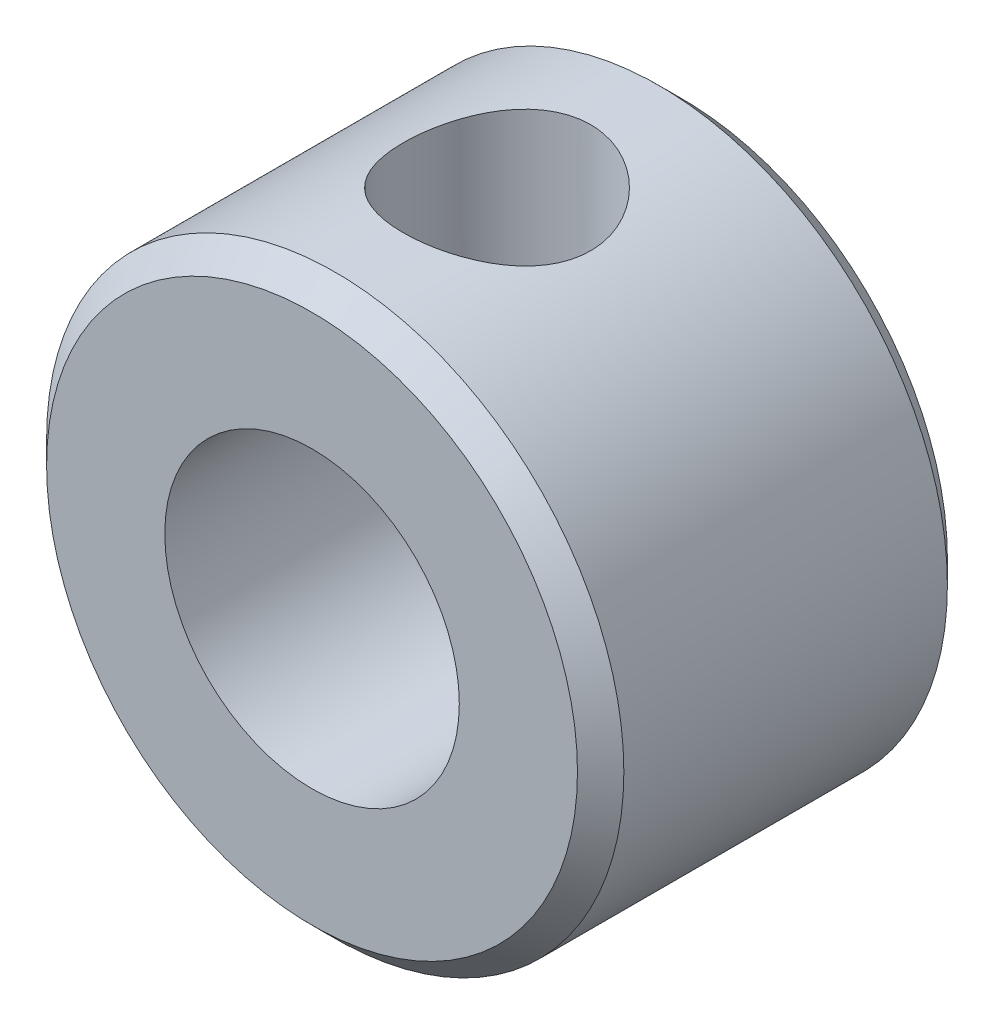
ISO-10303-21;
HEADER;
FILE_DESCRIPTION(('STEP AP214'),'2;1');
FILE_NAME('part.step','',(''),(''),'','','');
FILE_SCHEMA(('AUTOMOTIVE_DESIGN { 1 0 10303 214 1 1 1 1 }'));
ENDSEC;
DATA;
#1=APPLICATION_CONTEXT('core data for automotive mechanical design processes');
#2=APPLICATION_PROTOCOL_DEFINITION('international standard','automotive_design',2000,#1);
#3=PRODUCT_CONTEXT('',#1,'mechanical');
#4=PRODUCT('Part','Part','',(#3));
#5=PRODUCT_RELATED_PRODUCT_CATEGORY('part','',(#4));
#6=PRODUCT_DEFINITION_FORMATION('','',#4);
#7=PRODUCT_DEFINITION_CONTEXT('part definition',#1,'design');
#8=PRODUCT_DEFINITION('design','',#6,#7);
#9=PRODUCT_DEFINITION_SHAPE('','',#8);
#10=(LENGTH_UNIT() NAMED_UNIT(*) SI_UNIT(.MILLI.,.METRE.));
#11=(NAMED_UNIT(*) PLANE_ANGLE_UNIT() SI_UNIT($,.RADIAN.));
#12=(NAMED_UNIT(*) SI_UNIT($,.STERADIAN.) SOLID_ANGLE_UNIT());
#13=UNCERTAINTY_MEASURE_WITH_UNIT(LENGTH_MEASURE(1.E-05),#10,'distance_accuracy_value','');
#14=(GEOMETRIC_REPRESENTATION_CONTEXT(3) GLOBAL_UNCERTAINTY_ASSIGNED_CONTEXT((#13)) GLOBAL_UNIT_ASSIGNED_CONTEXT((#10,
#11,#12)) REPRESENTATION_CONTEXT('',''));
#15=CARTESIAN_POINT('',(0.,0.,0.));
#16=DIRECTION('',(0.,0.,1.));
#17=DIRECTION('',(1.,0.,0.));
#18=AXIS2_PLACEMENT_3D('',#15,#16,#17);
#19=CARTESIAN_POINT('',(0.,0.,-3.9878));
#20=DIRECTION('',(0.,0.,1.));
#21=DIRECTION('',(1.,0.,0.));
#22=AXIS2_PLACEMENT_3D('',#19,#20,#21);
#23=CYLINDRICAL_SURFACE('',#22,6.223);
#24=CARTESIAN_POINT('',(0.,6.223,-2.01929999999999));
#25=CARTESIAN_POINT('',(-0.110343510764421,6.22299991240961,-2.01929995614678));
#26=CARTESIAN_POINT('',(-0.220688547621907,6.2200378148079,-2.01022591707558));
#27=CARTESIAN_POINT('',(-0.43813838669422,6.20851250591087,-1.97427367910987));
#28=CARTESIAN_POINT('',(-0.545242680198986,6.19994841997657,-1.94739270000778));
#29=CARTESIAN_POINT('',(-0.753044440253262,6.17815186021323,-1.87683801107906));
#30=CARTESIAN_POINT('',(-0.853751971434932,6.16492694581129,-1.83319148315432));
#31=CARTESIAN_POINT('',(-1.04641817113306,6.1351653072985,-1.73046441937539));
#32=CARTESIAN_POINT('',(-1.1383752550724,6.11862798503645,-1.67138109537305));
#33=CARTESIAN_POINT('',(-1.31396737189153,6.08337754667322,-1.53740622773788));
#34=CARTESIAN_POINT('',(-1.3972732105779,6.06461431779935,-1.46209648115979));
#35=CARTESIAN_POINT('',(-1.55032134253976,6.02730870361427,-1.29869621513091));
#36=CARTESIAN_POINT('',(-1.62006085401559,6.00876636432706,-1.21060308087573));
#37=CARTESIAN_POINT('',(-1.74583492561646,5.97345652151974,-1.02122227979621));
#38=CARTESIAN_POINT('',(-1.80144878020222,5.95675042919629,-0.919642661754934));
#39=CARTESIAN_POINT('',(-1.89466489357519,5.92776301144131,-0.707942566763864));
#40=CARTESIAN_POINT('',(-1.93227232164475,5.91548041636405,-0.597824551576659));
#41=CARTESIAN_POINT('',(-1.98718617606239,5.8972568373458,-0.375904928722071));
#42=CARTESIAN_POINT('',(-2.00510682766404,5.89112453580322,-0.264271474885946));
#43=CARTESIAN_POINT('',(-2.02205809222139,5.88532903493098,-0.0394268501054633));
#44=CARTESIAN_POINT('',(-2.02109418444673,5.88566395916454,0.0737838536806623));
#45=CARTESIAN_POINT('',(-2.00078210158323,5.89259688238839,0.293399887668685));
#46=CARTESIAN_POINT('',(-1.98222639906683,5.89892489305517,0.399888495860971));
#47=CARTESIAN_POINT('',(-1.92854683026954,5.91669057019375,0.608150545824619));
#48=CARTESIAN_POINT('',(-1.89342107710975,5.92812881857502,0.709923449155371));
#49=CARTESIAN_POINT('',(-1.80706226080697,5.95502476907974,0.907703168927859));
#50=CARTESIAN_POINT('',(-1.75558837224277,5.97054192734821,1.00359639695847));
#51=CARTESIAN_POINT('',(-1.63816163387295,6.00382139153284,1.18563882560891));
#52=CARTESIAN_POINT('',(-1.57220478037491,6.02158431769528,1.27178532182985));
#53=CARTESIAN_POINT('',(-1.42384264461782,6.05842512580876,1.43635387075155));
#54=CARTESIAN_POINT('',(-1.34078671208325,6.0775246602616,1.51418564830078));
#55=CARTESIAN_POINT('',(-1.16256504036133,6.11411780505291,1.65496565190694));
#56=CARTESIAN_POINT('',(-1.06739825933907,6.13161127700682,1.71791259616402));
#57=CARTESIAN_POINT('',(-0.866453897033233,6.16323042196182,1.82757844745628));
#58=CARTESIAN_POINT('',(-0.760588790472581,6.17732447677571,1.87414671720461));
#59=CARTESIAN_POINT('',(-0.541961980897404,6.20032786546434,1.94863387483665));
#60=CARTESIAN_POINT('',(-0.429202556201084,6.20923890201098,1.97655888765763));
#61=CARTESIAN_POINT('',(-0.204990772345169,6.22059363722692,2.01193851203171));
#62=CARTESIAN_POINT('',(-0.0936769597661024,6.22328937755838,2.02019136366894));
#63=CARTESIAN_POINT('',(0.128762437777148,6.2226611691532,2.01825623046863));
#64=CARTESIAN_POINT('',(0.239888049838433,6.21933817681091,2.00807117546895));
#65=CARTESIAN_POINT('',(0.455651824107412,6.20721196220202,1.97018510032538));
#66=CARTESIAN_POINT('',(0.560384217898753,6.19856010961232,1.94296756755853));
#67=CARTESIAN_POINT('',(0.763759608535509,6.17680086010011,1.87238734228447));
#68=CARTESIAN_POINT('',(0.862401836020595,6.16369290160065,1.8290226147751));
#69=CARTESIAN_POINT('',(1.05359936174091,6.13394352805831,1.72614783664219));
#70=CARTESIAN_POINT('',(1.14593516013282,6.11722049698501,1.66625410145686));
#71=CARTESIAN_POINT('',(1.31950881642813,6.08214432282242,1.53247626579736));
#72=CARTESIAN_POINT('',(1.40074343347139,6.06379070627223,1.45858809476827));
#73=CARTESIAN_POINT('',(1.55343383808315,6.02652625590369,1.29516360033093));
#74=CARTESIAN_POINT('',(1.6243201750735,6.00762532200677,1.20509171470334));
#75=CARTESIAN_POINT('',(1.75003390231434,5.97221818954891,1.01392259810123));
#76=CARTESIAN_POINT('',(1.80486134234447,5.95571198356483,0.912825401304514));
#77=CARTESIAN_POINT('',(1.89660526724315,5.92713535507377,0.702549181360383));
#78=CARTESIAN_POINT('',(1.93357362017008,5.9150521120479,0.593394636667703));
#79=CARTESIAN_POINT('',(1.98845303510977,5.89683270373288,0.369931313012606));
#80=CARTESIAN_POINT('',(2.00637209551557,5.89069404253669,0.25562471831838));
#81=CARTESIAN_POINT('',(2.02204123413352,5.88533256371676,0.0310931150116252));
#82=CARTESIAN_POINT('',(2.02073164410965,5.88578729748728,-0.07905933694812));
#83=CARTESIAN_POINT('',(2.00027582938624,5.89277012260364,-0.297489276437896));
#84=CARTESIAN_POINT('',(1.9811305633057,5.89929788754056,-0.405766864418174));
#85=CARTESIAN_POINT('',(1.92619730522043,5.91745740473879,-0.615547059914038));
#86=CARTESIAN_POINT('',(1.89069848375472,5.92900028365708,-0.717133676910205));
#87=CARTESIAN_POINT('',(1.80429700414978,5.95586085763748,-0.912988498558728));
#88=CARTESIAN_POINT('',(1.75339104448042,5.97117936163152,-1.00725512919665));
#89=CARTESIAN_POINT('',(1.63513965685479,6.0046621994555,-1.19005445884109));
#90=CARTESIAN_POINT('',(1.56719698040182,6.02291859838509,-1.27818386312159));
#91=CARTESIAN_POINT('',(1.41782817394549,6.05981870833697,-1.44209457678211));
#92=CARTESIAN_POINT('',(1.33639832250818,6.07846252501192,-1.51787246660212));
#93=CARTESIAN_POINT('',(1.15882450880469,6.11484664134321,-1.6576855599286));
#94=CARTESIAN_POINT('',(1.06225466606378,6.1325298177681,-1.72119649576464));
#95=CARTESIAN_POINT('',(0.859239293084725,6.16424931267437,-1.83100717676466));
#96=CARTESIAN_POINT('',(0.752796898059275,6.17828678357249,-1.87731236270799));
#97=CARTESIAN_POINT('',(0.539855257107079,6.20040511556031,-1.94883343922131));
#98=CARTESIAN_POINT('',(0.433767560008049,6.20880096333192,-1.97517754724874));
#99=CARTESIAN_POINT('',(0.21845322892127,6.22009778308289,-2.01040873404282));
#100=CARTESIAN_POINT('',(0.109227362148477,6.22300008670439,-2.01930004340961));
#101=CARTESIAN_POINT('',(0.,6.223,-2.01929999999999));
#102=B_SPLINE_CURVE_WITH_KNOTS('',3,(#24,#25,#26,#27,#28,#29,#30,#31,#32,#33,#34,#35,#36,#37,
#38,#39,#40,#41,#42,#43,#44,#45,#46,#47,#48,#49,#50,#51,#52,#53,#54,#55,#56,#57,#58,#59,#60,#61,
#62,#63,#64,#65,#66,#67,#68,#69,#70,#71,#72,#73,#74,#75,#76,#77,#78,#79,#80,#81,#82,#83,#84,#85,
#86,#87,#88,#89,#90,#91,#92,#93,#94,#95,#96,#97,#98,#99,#100,#101),.UNSPECIFIED.,.T.,.F.,(4,2,2,
2,2,2,2,2,2,2,2,2,2,2,2,2,2,2,2,2,2,2,2,2,2,2,2,2,2,2,2,2,2,2,2,2,2,2,4),(0.,0.330628782954436,
0.661309199337908,0.991455732778822,1.32166193757536,1.66169717247375,2.00180205887857,
2.35108650175531,2.70027061189306,3.03822025280494,3.3760718406067,3.69939275834749,
4.02275050245372,4.35111170304979,4.67956379083992,5.0242102248934,5.3688863271998,
5.71665431364785,6.06430799031173,6.397595073083,6.73082920020058,7.05500825131018,
7.37922817196306,7.71171981318648,8.0443083150346,8.39117347655747,8.73803756285024,
9.08388810501269,9.4295933744587,9.75845152363048,10.0872919985922,10.4105286622561,
10.7338346400298,11.0706289080726,11.4075162609917,11.7565965905323,12.1055664402242,
12.4329302046765,12.760214605565),.UNSPECIFIED.);
#103=CARTESIAN_POINT('',(0.,6.223,-2.01929999999999));
#104=VERTEX_POINT('',#103);
#105=EDGE_CURVE('E70',#104,#104,#102,.T.);
#106=ORIENTED_EDGE('',*,*,#105,.F.);
#107=EDGE_LOOP('',(#106));
#108=FACE_BOUND('',#107,.T.);
#109=CARTESIAN_POINT('',(0.,0.,-3.4878));
#110=DIRECTION('',(0.,0.,1.));
#111=DIRECTION('',(1.,0.,0.));
#112=AXIS2_PLACEMENT_3D('',#109,#110,#111);
#113=CIRCLE('',#112,6.223);
#114=CARTESIAN_POINT('',(6.223,0.,-3.4878));
#115=VERTEX_POINT('',#114);
#116=EDGE_CURVE('E47',#115,#115,#113,.T.);
#117=ORIENTED_EDGE('',*,*,#116,.T.);
#118=EDGE_LOOP('',(#117));
#119=FACE_BOUND('',#118,.T.);
#120=CARTESIAN_POINT('',(0.,0.,3.4878));
#121=DIRECTION('',(0.,0.,1.));
#122=DIRECTION('',(1.,0.,0.));
#123=AXIS2_PLACEMENT_3D('',#120,#121,#122);
#124=CIRCLE('',#123,6.223);
#125=CARTESIAN_POINT('',(6.223,0.,3.4878));
#126=VERTEX_POINT('',#125);
#127=EDGE_CURVE('E51',#126,#126,#124,.F.);
#128=ORIENTED_EDGE('',*,*,#127,.T.);
#129=EDGE_LOOP('',(#128));
#130=FACE_BOUND('',#129,.T.);
#131=ADVANCED_FACE('F35',(#108,#119,#130),#23,.T.);
#132=CARTESIAN_POINT('',(0.,0.,-3.9878));
#133=DIRECTION('',(0.,0.,1.));
#134=DIRECTION('',(1.,0.,0.));
#135=AXIS2_PLACEMENT_3D('',#132,#133,#134);
#136=PLANE('',#135);
#137=CARTESIAN_POINT('',(0.,0.,-3.9878));
#138=DIRECTION('',(0.,0.,1.));
#139=DIRECTION('',(1.,0.,0.));
#140=AXIS2_PLACEMENT_3D('',#137,#138,#139);
#141=CIRCLE('',#140,5.723);
#142=CARTESIAN_POINT('',(5.723,0.,-3.9878));
#143=VERTEX_POINT('',#142);
#144=EDGE_CURVE('E43',#143,#143,#141,.F.);
#145=ORIENTED_EDGE('',*,*,#144,.T.);
#146=EDGE_LOOP('',(#145));
#147=FACE_BOUND('',#146,.T.);
#148=CARTESIAN_POINT('',(0.,0.,-3.9878));
#149=DIRECTION('',(0.,0.,1.));
#150=DIRECTION('',(1.,0.,0.));
#151=AXIS2_PLACEMENT_3D('',#148,#149,#150);
#152=CIRCLE('',#151,3.175);
#153=CARTESIAN_POINT('',(3.175,0.,-3.9878));
#154=VERTEX_POINT('',#153);
#155=EDGE_CURVE('E59',#154,#154,#152,.F.);
#156=ORIENTED_EDGE('',*,*,#155,.F.);
#157=EDGE_LOOP('',(#156));
#158=FACE_BOUND('',#157,.T.);
#159=ADVANCED_FACE('F98',(#147,#158),#136,.F.);
#160=CARTESIAN_POINT('',(0.,0.,3.9878));
#161=DIRECTION('',(0.,0.,1.));
#162=DIRECTION('',(1.,0.,0.));
#163=AXIS2_PLACEMENT_3D('',#160,#161,#162);
#164=PLANE('',#163);
#165=CARTESIAN_POINT('',(0.,0.,3.9878));
#166=DIRECTION('',(0.,0.,1.));
#167=DIRECTION('',(1.,0.,0.));
#168=AXIS2_PLACEMENT_3D('',#165,#166,#167);
#169=CIRCLE('',#168,5.723);
#170=CARTESIAN_POINT('',(5.723,0.,3.9878));
#171=VERTEX_POINT('',#170);
#172=EDGE_CURVE('E10',#171,#171,#169,.T.);
#173=ORIENTED_EDGE('',*,*,#172,.T.);
#174=EDGE_LOOP('',(#173));
#175=FACE_BOUND('',#174,.T.);
#176=CARTESIAN_POINT('',(0.,0.,3.9878));
#177=DIRECTION('',(0.,0.,1.));
#178=DIRECTION('',(1.,0.,0.));
#179=AXIS2_PLACEMENT_3D('',#176,#177,#178);
#180=CIRCLE('',#179,3.175);
#181=CARTESIAN_POINT('',(3.175,0.,3.9878));
#182=VERTEX_POINT('',#181);
#183=EDGE_CURVE('E56',#182,#182,#180,.F.);
#184=ORIENTED_EDGE('',*,*,#183,.T.);
#185=EDGE_LOOP('',(#184));
#186=FACE_BOUND('',#185,.T.);
#187=ADVANCED_FACE('F91',(#175,#186),#164,.T.);
#188=CARTESIAN_POINT('',(0.,0.,-3.9878));
#189=DIRECTION('',(0.,0.,1.));
#190=DIRECTION('',(1.,0.,0.));
#191=AXIS2_PLACEMENT_3D('',#188,#189,#190);
#192=CYLINDRICAL_SURFACE('',#191,3.175);
#193=CARTESIAN_POINT('',(0.,3.175,-2.01929999999999));
#194=CARTESIAN_POINT('',(0.102275041570351,3.17499212218742,-2.01929143965553));
#195=CARTESIAN_POINT('',(0.204663948744718,3.17000679874075,-2.01147696356882));
#196=CARTESIAN_POINT('',(0.406278072049932,3.15053510862914,-1.98064527104774));
#197=CARTESIAN_POINT('',(0.505497460962832,3.13603219182987,-1.95760157203821));
#198=CARTESIAN_POINT('',(0.697469668100845,3.09897945913749,-1.89767536654758));
#199=CARTESIAN_POINT('',(0.790251965874981,3.07646968317457,-1.86086167332952));
#200=CARTESIAN_POINT('',(0.96798385605442,3.02526013654449,-1.77491840151874));
#201=CARTESIAN_POINT('',(1.05293403637499,2.9965608310332,-1.72578974837557));
#202=CARTESIAN_POINT('',(1.22039873226055,2.93256277924019,-1.61222031168925));
#203=CARTESIAN_POINT('',(1.3021541541713,2.89691724195524,-1.54685956659122));
#204=CARTESIAN_POINT('',(1.45427585258572,2.82362413681097,-1.40481514759952));
#205=CARTESIAN_POINT('',(1.52462619854515,2.78597386455601,-1.32811591706343));
#206=CARTESIAN_POINT('',(1.66206543309412,2.70653031413333,-1.15291312688873));
#207=CARTESIAN_POINT('',(1.72729055130934,2.66490287506758,-1.05285997830798));
#208=CARTESIAN_POINT('',(1.83983395520866,2.58848866777314,-0.840790700687554));
#209=CARTESIAN_POINT('',(1.88718285725214,2.55369025311667,-0.728795450631966));
#210=CARTESIAN_POINT('',(1.95156224001302,2.50463798235853,-0.526353573531232));
#211=CARTESIAN_POINT('',(1.97331282288363,2.48737926319144,-0.438141599180126));
#212=CARTESIAN_POINT('',(2.00477482055267,2.46209734155056,-0.258355877350785));
#213=CARTESIAN_POINT('',(2.01450417871408,2.45406037559985,-0.16678735088703));
#214=CARTESIAN_POINT('',(2.02133295126505,2.44844089318853,0.0174264440076907));
#215=CARTESIAN_POINT('',(2.01839497710359,2.45088932499695,0.110074093877146));
#216=CARTESIAN_POINT('',(2.00000919911575,2.46591124637833,0.293308921800895));
#217=CARTESIAN_POINT('',(1.98455114545894,2.47849303179027,0.383894349078538));
#218=CARTESIAN_POINT('',(1.9426406755202,2.5114634605905,0.558156605747085));
#219=CARTESIAN_POINT('',(1.91650651911699,2.53162486882101,0.641955591631328));
#220=CARTESIAN_POINT('',(1.85432038094186,2.57752031440751,0.804126859953402));
#221=CARTESIAN_POINT('',(1.8182650878077,2.60325621174055,0.882497319569276));
#222=CARTESIAN_POINT('',(1.72932876824587,2.6633521041401,1.04756420862492));
#223=CARTESIAN_POINT('',(1.6745474377715,2.6984196544858,1.1329781231468));
#224=CARTESIAN_POINT('',(1.55319088466405,2.77005411277688,1.29436513819511));
#225=CARTESIAN_POINT('',(1.48660181281293,2.80662274219306,1.37032697243656));
#226=CARTESIAN_POINT('',(1.32960028569558,2.88474864185399,1.52442980683521));
#227=CARTESIAN_POINT('',(1.23705711933928,2.92603774183837,1.60055964392835));
#228=CARTESIAN_POINT('',(1.0381921229636,3.00234660451872,1.73613496814225));
#229=CARTESIAN_POINT('',(0.931885390793905,3.03737313810323,1.79559851431009));
#230=CARTESIAN_POINT('',(0.730092345463664,3.09131764246758,1.88525833040918));
#231=CARTESIAN_POINT('',(0.636630347052188,3.11205186463951,1.91891814909189));
#232=CARTESIAN_POINT('',(0.444413569663524,3.14525139549152,1.97230711309869));
#233=CARTESIAN_POINT('',(0.345663072769126,3.15772328793695,1.99204735092907));
#234=CARTESIAN_POINT('',(0.145247031750992,3.17327247447325,2.01660545426343));
#235=CARTESIAN_POINT('',(0.0435731547102153,3.17631951183841,2.02137526073011));
#236=CARTESIAN_POINT('',(-0.159161564830497,3.17262837891011,2.01557027759348));
#237=CARTESIAN_POINT('',(-0.260222360951876,3.16588947737162,2.00499434129409));
#238=CARTESIAN_POINT('',(-0.453545546030755,3.14386957546433,1.97003398927967));
#239=CARTESIAN_POINT('',(-0.545994183259857,3.12903933230956,1.9463774142151));
#240=CARTESIAN_POINT('',(-0.725383942286245,3.09238314692142,1.88688328974224));
#241=CARTESIAN_POINT('',(-0.812324132435729,3.07055602506331,1.85104368629907));
#242=CARTESIAN_POINT('',(-0.985513554819466,3.01962653249605,1.76532469067284));
#243=CARTESIAN_POINT('',(-1.07120913338102,2.99009760848239,1.71458591832282));
#244=CARTESIAN_POINT('',(-1.23329766280981,2.92697501640169,1.60196928369764));
#245=CARTESIAN_POINT('',(-1.30968310074508,2.89337810863513,1.54008252389904));
#246=CARTESIAN_POINT('',(-1.46312883138038,2.81925311715627,1.39624590798106));
#247=CARTESIAN_POINT('',(-1.5385399767099,2.77844582051285,1.31267704038413));
#248=CARTESIAN_POINT('',(-1.67482589073675,2.69848578412998,1.13366099064734));
#249=CARTESIAN_POINT('',(-1.73569878964202,2.65933325774613,1.03821228301692));
#250=CARTESIAN_POINT('',(-1.83384260188465,2.59242399914096,0.850948732611832));
#251=CARTESIAN_POINT('',(-1.87323995547865,2.56383843593366,0.760551475860476));
#252=CARTESIAN_POINT('',(-1.93881492302712,2.51461975244491,0.573063022843386));
#253=CARTESIAN_POINT('',(-1.96501114696942,2.4939754469369,0.475981470452242));
#254=CARTESIAN_POINT('',(-2.00290039729267,2.46366295169805,0.276327215660928));
#255=CARTESIAN_POINT('',(-2.01446098670786,2.45409505725333,0.17371300996413));
#256=CARTESIAN_POINT('',(-2.02166710369554,2.44816666813603,-0.0324330820703825));
#257=CARTESIAN_POINT('',(-2.01732235383118,2.4517981050102,-0.135964369215071));
#258=CARTESIAN_POINT('',(-1.99481282731697,2.47012079556712,-0.325826720148385));
#259=CARTESIAN_POINT('',(-1.97863020035237,2.48322286589144,-0.412565611577875));
#260=CARTESIAN_POINT('',(-1.93562453165794,2.51688812246693,-0.581868836145927));
#261=CARTESIAN_POINT('',(-1.90879125463429,2.53745848413264,-0.664429067280155));
#262=CARTESIAN_POINT('',(-1.83453213645738,2.59188888887619,-0.851717799299312));
#263=CARTESIAN_POINT('',(-1.78319601633736,2.6278856252903,-0.954273049947509));
#264=CARTESIAN_POINT('',(-1.66498968273404,2.70432924352512,-1.14817919342465));
#265=CARTESIAN_POINT('',(-1.59809863913567,2.74478205404977,-1.23951480877444));
#266=CARTESIAN_POINT('',(-1.44926145737009,2.82622298925022,-1.41074698784758));
#267=CARTESIAN_POINT('',(-1.36715686389169,2.86721208276525,-1.49050573592319));
#268=CARTESIAN_POINT('',(-1.1895449829363,2.94534120010866,-1.63576450612535));
#269=CARTESIAN_POINT('',(-1.09403777754423,2.98248124750828,-1.70126461557333));
#270=CARTESIAN_POINT('',(-0.888385881992062,3.05013846389934,-1.81729933764849));
#271=CARTESIAN_POINT('',(-0.777927590640468,3.08046045600151,-1.86740513314878));
#272=CARTESIAN_POINT('',(-0.605427728914389,3.11730041421457,-1.9273677860614));
#273=CARTESIAN_POINT('',(-0.546842243784907,3.12813464368599,-1.944814719106));
#274=CARTESIAN_POINT('',(-0.427869843173629,3.14661127671428,-1.97439774274739));
#275=CARTESIAN_POINT('',(-0.367484242510018,3.15425595157205,-1.98653761283079));
#276=CARTESIAN_POINT('',(-0.255971221121607,3.16507251999973,-2.00366340176665));
#277=CARTESIAN_POINT('',(-0.205027735964814,3.16878594100635,-2.00951801938967));
#278=CARTESIAN_POINT('',(-0.10273242122425,3.17375169673817,-2.01733852709741));
#279=CARTESIAN_POINT('',(-0.0513805794361004,3.17500395762807,-2.01930430051604));
#280=CARTESIAN_POINT('',(0.,3.175,-2.01929999999999));
#281=B_SPLINE_CURVE_WITH_KNOTS('',3,(#193,#194,#195,#196,#197,#198,#199,#200,#201,#202,#203,
#204,#205,#206,#207,#208,#209,#210,#211,#212,#213,#214,#215,#216,#217,#218,#219,#220,#221,#222,
#223,#224,#225,#226,#227,#228,#229,#230,#231,#232,#233,#234,#235,#236,#237,#238,#239,#240,#241,
#242,#243,#244,#245,#246,#247,#248,#249,#250,#251,#252,#253,#254,#255,#256,#257,#258,#259,#260,
#261,#262,#263,#264,#265,#266,#267,#268,#269,#270,#271,#272,#273,#274,#275,#276,#277,#278,#279,
#280),.UNSPECIFIED.,.T.,.F.,(4,2,2,2,2,2,2,2,2,2,2,2,2,2,2,2,2,2,2,2,2,2,2,2,2,2,2,2,2,2,2,2,2,
2,2,2,2,2,2,2,2,2,2,4),(0.,0.306618688447365,0.613771973685192,0.919410384700763,
1.2250258343603,1.55547991466606,1.88639166683373,2.2640374116617,2.64103340143298,
2.91733101609382,3.19321571765492,3.46991526949968,3.74684157658549,4.01605368121482,
4.28535574956627,4.60626536454536,4.92755389229747,5.30593192152139,5.68389835350098,
5.98703820526838,6.28993621120916,6.59380561032801,6.89769771696901,7.18617094760005,
7.47469283839887,7.78512110231491,8.09579823449312,8.45351764572916,8.81128303920725,
9.11810928918363,9.42450177937294,9.73364742929523,10.0426041372508,10.3090843788023,
10.5758213307902,10.9345409073162,11.2937436519909,11.6569225744499,12.0200992726999,
12.392628264387,12.5785937254861,12.7644265325087,12.918459941123,13.0724979706996),.UNSPECIFIED.);
#282=CARTESIAN_POINT('',(0.,3.175,-2.01929999999999));
#283=VERTEX_POINT('',#282);
#284=EDGE_CURVE('E62',#283,#283,#281,.T.);
#285=ORIENTED_EDGE('',*,*,#284,.F.);
#286=EDGE_LOOP('',(#285));
#287=FACE_BOUND('',#286,.T.);
#288=ORIENTED_EDGE('',*,*,#183,.F.);
#289=EDGE_LOOP('',(#288));
#290=FACE_BOUND('',#289,.T.);
#291=ORIENTED_EDGE('',*,*,#155,.T.);
#292=EDGE_LOOP('',(#291));
#293=FACE_BOUND('',#292,.T.);
#294=ADVANCED_FACE('F75',(#287,#290,#293),#192,.F.);
#295=CARTESIAN_POINT('',(0.,0.,-3.4878));
#296=DIRECTION('',(0.,0.,1.));
#297=DIRECTION('',(1.,0.,0.));
#298=AXIS2_PLACEMENT_3D('',#295,#296,#297);
#299=CONICAL_SURFACE('',#298,6.223,0.785398163397448);
#300=ORIENTED_EDGE('',*,*,#144,.F.);
#301=EDGE_LOOP('',(#300));
#302=FACE_BOUND('',#301,.T.);
#303=ORIENTED_EDGE('',*,*,#116,.F.);
#304=EDGE_LOOP('',(#303));
#305=FACE_BOUND('',#304,.T.);
#306=ADVANCED_FACE('F87',(#302,#305),#299,.T.);
#307=CARTESIAN_POINT('',(0.,0.,3.9878));
#308=DIRECTION('',(0.,0.,-1.));
#309=DIRECTION('',(-1.,0.,0.));
#310=AXIS2_PLACEMENT_3D('',#307,#308,#309);
#311=CONICAL_SURFACE('',#310,5.723,0.785398163397448);
#312=ORIENTED_EDGE('',*,*,#127,.F.);
#313=EDGE_LOOP('',(#312));
#314=FACE_BOUND('',#313,.T.);
#315=ORIENTED_EDGE('',*,*,#172,.F.);
#316=EDGE_LOOP('',(#315));
#317=FACE_BOUND('',#316,.T.);
#318=ADVANCED_FACE('F38',(#314,#317),#311,.T.);
#319=CARTESIAN_POINT('',(0.,0.,0.));
#320=DIRECTION('',(0.,-1.,0.));
#321=DIRECTION('',(0.,0.,-1.));
#322=AXIS2_PLACEMENT_3D('',#319,#320,#321);
#323=CYLINDRICAL_SURFACE('',#322,2.01929999999999);
#324=ORIENTED_EDGE('',*,*,#284,.T.);
#325=EDGE_LOOP('',(#324));
#326=FACE_BOUND('',#325,.T.);
#327=ORIENTED_EDGE('',*,*,#105,.T.);
#328=EDGE_LOOP('',(#327));
#329=FACE_BOUND('',#328,.T.);
#330=ADVANCED_FACE('F78',(#326,#329),#323,.F.);
#331=CLOSED_SHELL('',(#131,#159,#187,#294,#306,#318,#330));
#332=MANIFOLD_SOLID_BREP('B2',#331);
#333=ADVANCED_BREP_SHAPE_REPRESENTATION('',(#18,#332),#14);
#334=SHAPE_DEFINITION_REPRESENTATION(#9,#333);
ENDSEC;
END-ISO-10303-21;
